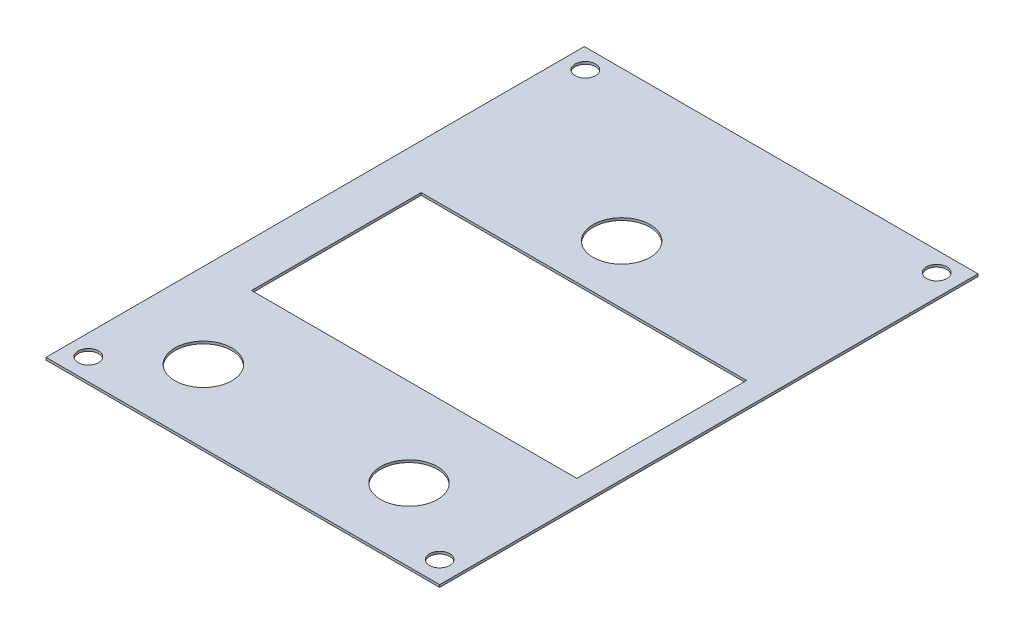
ISO-10303-21;
HEADER;
FILE_DESCRIPTION(('STEP AP214'),'2;1');
FILE_NAME('part.step','',(''),(''),'','','');
FILE_SCHEMA(('AUTOMOTIVE_DESIGN { 1 0 10303 214 1 1 1 1 }'));
ENDSEC;
DATA;
#1=APPLICATION_CONTEXT('core data for automotive mechanical design processes');
#2=APPLICATION_PROTOCOL_DEFINITION('international standard','automotive_design',2000,#1);
#3=PRODUCT_CONTEXT('',#1,'mechanical');
#4=PRODUCT('Part','Part','',(#3));
#5=PRODUCT_RELATED_PRODUCT_CATEGORY('part','',(#4));
#6=PRODUCT_DEFINITION_FORMATION('','',#4);
#7=PRODUCT_DEFINITION_CONTEXT('part definition',#1,'design');
#8=PRODUCT_DEFINITION('design','',#6,#7);
#9=PRODUCT_DEFINITION_SHAPE('','',#8);
#10=(LENGTH_UNIT() NAMED_UNIT(*) SI_UNIT(.MILLI.,.METRE.));
#11=(NAMED_UNIT(*) PLANE_ANGLE_UNIT() SI_UNIT($,.RADIAN.));
#12=(NAMED_UNIT(*) SI_UNIT($,.STERADIAN.) SOLID_ANGLE_UNIT());
#13=UNCERTAINTY_MEASURE_WITH_UNIT(LENGTH_MEASURE(1.E-05),#10,'distance_accuracy_value','');
#14=(GEOMETRIC_REPRESENTATION_CONTEXT(3) GLOBAL_UNCERTAINTY_ASSIGNED_CONTEXT((#13)) GLOBAL_UNIT_ASSIGNED_CONTEXT((#10,
#11,#12)) REPRESENTATION_CONTEXT('',''));
#15=CARTESIAN_POINT('',(0.,0.,0.));
#16=DIRECTION('',(0.,0.,1.));
#17=DIRECTION('',(1.,0.,0.));
#18=AXIS2_PLACEMENT_3D('',#15,#16,#17);
#19=CARTESIAN_POINT('',(0.,0.3,0.));
#20=DIRECTION('',(0.,1.,0.));
#21=DIRECTION('',(0.,0.,1.));
#22=AXIS2_PLACEMENT_3D('',#19,#20,#21);
#23=PLANE('',#22);
#24=CARTESIAN_POINT('',(33.146,0.3,-6.264));
#25=DIRECTION('',(0.,1.,0.));
#26=DIRECTION('',(0.,0.,1.));
#27=AXIS2_PLACEMENT_3D('',#24,#25,#26);
#28=CIRCLE('',#27,3.5);
#29=CARTESIAN_POINT('',(33.146,0.3,-2.764));
#30=VERTEX_POINT('',#29);
#31=EDGE_CURVE('E167',#30,#30,#28,.T.);
#32=ORIENTED_EDGE('',*,*,#31,.F.);
#33=EDGE_LOOP('',(#32));
#34=FACE_BOUND('',#33,.T.);
#35=CARTESIAN_POINT('',(0.,0.3,0.));
#36=DIRECTION('',(0.,1.,0.));
#37=DIRECTION('',(0.,0.,1.));
#38=AXIS2_PLACEMENT_3D('',#35,#36,#37);
#39=CIRCLE('',#38,1.25);
#40=CARTESIAN_POINT('',(0.,0.3,1.25));
#41=VERTEX_POINT('',#40);
#42=EDGE_CURVE('E183',#41,#41,#39,.T.);
#43=ORIENTED_EDGE('',*,*,#42,.F.);
#44=EDGE_LOOP('',(#43));
#45=FACE_BOUND('',#44,.T.);
#46=CARTESIAN_POINT('',(43.18,0.3,-61.087));
#47=DIRECTION('',(0.,1.,0.));
#48=DIRECTION('',(0.,0.,1.));
#49=AXIS2_PLACEMENT_3D('',#46,#47,#48);
#50=CIRCLE('',#49,1.25);
#51=CARTESIAN_POINT('',(43.18,0.3,-59.837));
#52=VERTEX_POINT('',#51);
#53=EDGE_CURVE('E199',#52,#52,#50,.T.);
#54=ORIENTED_EDGE('',*,*,#53,.F.);
#55=EDGE_LOOP('',(#54));
#56=FACE_BOUND('',#55,.T.);
#57=DIRECTION('',(0.,0.,1.));
#58=VECTOR('',#57,1.);
#59=CARTESIAN_POINT('',(-2.54,0.3,-63.5));
#60=LINE('',#59,#58);
#61=CARTESIAN_POINT('',(-2.54,0.3,-63.5));
#62=VERTEX_POINT('',#61);
#63=CARTESIAN_POINT('',(-2.53999999999999,0.3,2.667));
#64=VERTEX_POINT('',#63);
#65=EDGE_CURVE('E215',#62,#64,#60,.T.);
#66=ORIENTED_EDGE('',*,*,#65,.T.);
#67=DIRECTION('',(1.,0.,0.));
#68=VECTOR('',#67,1.);
#69=CARTESIAN_POINT('',(-2.53999999999999,0.3,2.667));
#70=LINE('',#69,#68);
#71=CARTESIAN_POINT('',(45.847,0.3,2.667));
#72=VERTEX_POINT('',#71);
#73=EDGE_CURVE('E219',#64,#72,#70,.T.);
#74=ORIENTED_EDGE('',*,*,#73,.T.);
#75=DIRECTION('',(0.,0.,-1.));
#76=VECTOR('',#75,1.);
#77=CARTESIAN_POINT('',(45.847,0.3,-63.5));
#78=LINE('',#77,#76);
#79=CARTESIAN_POINT('',(45.847,0.3,-63.5));
#80=VERTEX_POINT('',#79);
#81=EDGE_CURVE('E223',#72,#80,#78,.T.);
#82=ORIENTED_EDGE('',*,*,#81,.T.);
#83=DIRECTION('',(-1.,0.,0.));
#84=VECTOR('',#83,1.);
#85=CARTESIAN_POINT('',(-2.54,0.3,-63.5));
#86=LINE('',#85,#84);
#87=EDGE_CURVE('E226',#80,#62,#86,.T.);
#88=ORIENTED_EDGE('',*,*,#87,.T.);
#89=EDGE_LOOP('',(#66,#74,#82,#88));
#90=FACE_BOUND('',#89,.T.);
#91=CARTESIAN_POINT('',(0.,0.3,-61.087));
#92=DIRECTION('',(0.,1.,0.));
#93=DIRECTION('',(0.,0.,1.));
#94=AXIS2_PLACEMENT_3D('',#91,#92,#93);
#95=CIRCLE('',#94,1.25);
#96=CARTESIAN_POINT('',(0.,0.3,-59.837));
#97=VERTEX_POINT('',#96);
#98=EDGE_CURVE('E207',#97,#97,#95,.T.);
#99=ORIENTED_EDGE('',*,*,#98,.F.);
#100=EDGE_LOOP('',(#99));
#101=FACE_BOUND('',#100,.T.);
#102=CARTESIAN_POINT('',(43.18,0.3,0.));
#103=DIRECTION('',(0.,1.,0.));
#104=DIRECTION('',(0.,0.,1.));
#105=AXIS2_PLACEMENT_3D('',#102,#103,#104);
#106=CIRCLE('',#105,1.25);
#107=CARTESIAN_POINT('',(43.18,0.3,1.25));
#108=VERTEX_POINT('',#107);
#109=EDGE_CURVE('E191',#108,#108,#106,.T.);
#110=ORIENTED_EDGE('',*,*,#109,.F.);
#111=EDGE_LOOP('',(#110));
#112=FACE_BOUND('',#111,.T.);
#113=CARTESIAN_POINT('',(20.445,0.3,-45.103));
#114=DIRECTION('',(0.,1.,0.));
#115=DIRECTION('',(0.,0.,1.));
#116=AXIS2_PLACEMENT_3D('',#113,#114,#115);
#117=CIRCLE('',#116,3.5);
#118=CARTESIAN_POINT('',(20.445,0.3,-41.603));
#119=VERTEX_POINT('',#118);
#120=EDGE_CURVE('E175',#119,#119,#117,.T.);
#121=ORIENTED_EDGE('',*,*,#120,.F.);
#122=EDGE_LOOP('',(#121));
#123=FACE_BOUND('',#122,.T.);
#124=CARTESIAN_POINT('',(7.873,0.3,-6.264));
#125=DIRECTION('',(0.,1.,0.));
#126=DIRECTION('',(0.,0.,1.));
#127=AXIS2_PLACEMENT_3D('',#124,#125,#126);
#128=CIRCLE('',#127,3.5);
#129=CARTESIAN_POINT('',(7.873,0.3,-2.764));
#130=VERTEX_POINT('',#129);
#131=EDGE_CURVE('E159',#130,#130,#128,.T.);
#132=ORIENTED_EDGE('',*,*,#131,.F.);
#133=EDGE_LOOP('',(#132));
#134=FACE_BOUND('',#133,.T.);
#135=DIRECTION('',(1.,0.,0.));
#136=VECTOR('',#135,1.);
#137=CARTESIAN_POINT('',(2.973,0.3,-17.0735663614329));
#138=LINE('',#137,#136);
#139=CARTESIAN_POINT('',(2.973,0.3,-17.0735663614329));
#140=VERTEX_POINT('',#139);
#141=CARTESIAN_POINT('',(42.973,0.3,-17.0735663614329));
#142=VERTEX_POINT('',#141);
#143=EDGE_CURVE('E120',#140,#142,#138,.T.);
#144=ORIENTED_EDGE('',*,*,#143,.F.);
#145=DIRECTION('',(0.,0.,1.));
#146=VECTOR('',#145,1.);
#147=CARTESIAN_POINT('',(2.973,0.3,-37.933286915108));
#148=LINE('',#147,#146);
#149=CARTESIAN_POINT('',(2.973,0.3,-37.933286915108));
#150=VERTEX_POINT('',#149);
#151=EDGE_CURVE('E111',#150,#140,#148,.T.);
#152=ORIENTED_EDGE('',*,*,#151,.F.);
#153=DIRECTION('',(-1.,0.,0.));
#154=VECTOR('',#153,1.);
#155=CARTESIAN_POINT('',(2.973,0.3,-37.933286915108));
#156=LINE('',#155,#154);
#157=CARTESIAN_POINT('',(42.973,0.3,-37.933286915108));
#158=VERTEX_POINT('',#157);
#159=EDGE_CURVE('E137',#158,#150,#156,.T.);
#160=ORIENTED_EDGE('',*,*,#159,.F.);
#161=DIRECTION('',(0.,0.,-1.));
#162=VECTOR('',#161,1.);
#163=CARTESIAN_POINT('',(42.973,0.3,-37.933286915108));
#164=LINE('',#163,#162);
#165=EDGE_CURVE('E133',#142,#158,#164,.T.);
#166=ORIENTED_EDGE('',*,*,#165,.F.);
#167=EDGE_LOOP('',(#144,#152,#160,#166));
#168=FACE_BOUND('',#167,.T.);
#169=ADVANCED_FACE('F45',(#34,#45,#56,#90,#101,#112,#123,#134,#168),#23,.T.);
#170=CARTESIAN_POINT('',(0.,0.,0.));
#171=DIRECTION('',(0.,1.,0.));
#172=DIRECTION('',(0.,0.,1.));
#173=AXIS2_PLACEMENT_3D('',#170,#171,#172);
#174=PLANE('',#173);
#175=CARTESIAN_POINT('',(7.873,0.,-6.264));
#176=DIRECTION('',(0.,1.,0.));
#177=DIRECTION('',(0.,0.,1.));
#178=AXIS2_PLACEMENT_3D('',#175,#176,#177);
#179=CIRCLE('',#178,3.5);
#180=CARTESIAN_POINT('',(7.873,0.,-2.764));
#181=VERTEX_POINT('',#180);
#182=EDGE_CURVE('E129',#181,#181,#179,.T.);
#183=ORIENTED_EDGE('',*,*,#182,.T.);
#184=EDGE_LOOP('',(#183));
#185=FACE_BOUND('',#184,.T.);
#186=CARTESIAN_POINT('',(33.146,0.,-6.264));
#187=DIRECTION('',(0.,1.,0.));
#188=DIRECTION('',(0.,0.,1.));
#189=AXIS2_PLACEMENT_3D('',#186,#187,#188);
#190=CIRCLE('',#189,3.5);
#191=CARTESIAN_POINT('',(33.146,0.,-2.764));
#192=VERTEX_POINT('',#191);
#193=EDGE_CURVE('E163',#192,#192,#190,.T.);
#194=ORIENTED_EDGE('',*,*,#193,.T.);
#195=EDGE_LOOP('',(#194));
#196=FACE_BOUND('',#195,.T.);
#197=CARTESIAN_POINT('',(20.445,0.,-45.103));
#198=DIRECTION('',(0.,1.,0.));
#199=DIRECTION('',(0.,0.,1.));
#200=AXIS2_PLACEMENT_3D('',#197,#198,#199);
#201=CIRCLE('',#200,3.5);
#202=CARTESIAN_POINT('',(20.445,0.,-41.603));
#203=VERTEX_POINT('',#202);
#204=EDGE_CURVE('E171',#203,#203,#201,.T.);
#205=ORIENTED_EDGE('',*,*,#204,.T.);
#206=EDGE_LOOP('',(#205));
#207=FACE_BOUND('',#206,.T.);
#208=CARTESIAN_POINT('',(0.,0.,0.));
#209=DIRECTION('',(0.,1.,0.));
#210=DIRECTION('',(0.,0.,1.));
#211=AXIS2_PLACEMENT_3D('',#208,#209,#210);
#212=CIRCLE('',#211,1.25);
#213=CARTESIAN_POINT('',(0.,0.,1.25));
#214=VERTEX_POINT('',#213);
#215=EDGE_CURVE('E179',#214,#214,#212,.T.);
#216=ORIENTED_EDGE('',*,*,#215,.T.);
#217=EDGE_LOOP('',(#216));
#218=FACE_BOUND('',#217,.T.);
#219=CARTESIAN_POINT('',(43.18,0.,0.));
#220=DIRECTION('',(0.,1.,0.));
#221=DIRECTION('',(0.,0.,1.));
#222=AXIS2_PLACEMENT_3D('',#219,#220,#221);
#223=CIRCLE('',#222,1.25);
#224=CARTESIAN_POINT('',(43.18,0.,1.25));
#225=VERTEX_POINT('',#224);
#226=EDGE_CURVE('E187',#225,#225,#223,.T.);
#227=ORIENTED_EDGE('',*,*,#226,.T.);
#228=EDGE_LOOP('',(#227));
#229=FACE_BOUND('',#228,.T.);
#230=CARTESIAN_POINT('',(43.18,0.,-61.087));
#231=DIRECTION('',(0.,1.,0.));
#232=DIRECTION('',(0.,0.,1.));
#233=AXIS2_PLACEMENT_3D('',#230,#231,#232);
#234=CIRCLE('',#233,1.25);
#235=CARTESIAN_POINT('',(43.18,0.,-59.837));
#236=VERTEX_POINT('',#235);
#237=EDGE_CURVE('E195',#236,#236,#234,.T.);
#238=ORIENTED_EDGE('',*,*,#237,.T.);
#239=EDGE_LOOP('',(#238));
#240=FACE_BOUND('',#239,.T.);
#241=CARTESIAN_POINT('',(0.,0.,-61.087));
#242=DIRECTION('',(0.,1.,0.));
#243=DIRECTION('',(0.,0.,1.));
#244=AXIS2_PLACEMENT_3D('',#241,#242,#243);
#245=CIRCLE('',#244,1.25);
#246=CARTESIAN_POINT('',(0.,0.,-59.837));
#247=VERTEX_POINT('',#246);
#248=EDGE_CURVE('E203',#247,#247,#245,.T.);
#249=ORIENTED_EDGE('',*,*,#248,.T.);
#250=EDGE_LOOP('',(#249));
#251=FACE_BOUND('',#250,.T.);
#252=DIRECTION('',(0.,0.,1.));
#253=VECTOR('',#252,1.);
#254=CARTESIAN_POINT('',(-2.54,0.,-63.5));
#255=LINE('',#254,#253);
#256=CARTESIAN_POINT('',(-2.54,0.,-63.5));
#257=VERTEX_POINT('',#256);
#258=CARTESIAN_POINT('',(-2.53999999999999,0.,2.667));
#259=VERTEX_POINT('',#258);
#260=EDGE_CURVE('E211',#257,#259,#255,.T.);
#261=ORIENTED_EDGE('',*,*,#260,.F.);
#262=DIRECTION('',(-1.,0.,0.));
#263=VECTOR('',#262,1.);
#264=CARTESIAN_POINT('',(-2.54,0.,-63.5));
#265=LINE('',#264,#263);
#266=CARTESIAN_POINT('',(45.847,0.,-63.5));
#267=VERTEX_POINT('',#266);
#268=EDGE_CURVE('E220',#267,#257,#265,.T.);
#269=ORIENTED_EDGE('',*,*,#268,.F.);
#270=DIRECTION('',(0.,0.,-1.));
#271=VECTOR('',#270,1.);
#272=CARTESIAN_POINT('',(45.847,0.,-63.5));
#273=LINE('',#272,#271);
#274=CARTESIAN_POINT('',(45.847,0.,2.667));
#275=VERTEX_POINT('',#274);
#276=EDGE_CURVE('E236',#275,#267,#273,.T.);
#277=ORIENTED_EDGE('',*,*,#276,.F.);
#278=DIRECTION('',(1.,0.,0.));
#279=VECTOR('',#278,1.);
#280=CARTESIAN_POINT('',(-2.53999999999999,0.,2.667));
#281=LINE('',#280,#279);
#282=EDGE_CURVE('E233',#259,#275,#281,.T.);
#283=ORIENTED_EDGE('',*,*,#282,.F.);
#284=EDGE_LOOP('',(#261,#269,#277,#283));
#285=FACE_BOUND('',#284,.T.);
#286=DIRECTION('',(0.,0.,1.));
#287=VECTOR('',#286,1.);
#288=CARTESIAN_POINT('',(2.973,0.,-37.933286915108));
#289=LINE('',#288,#287);
#290=CARTESIAN_POINT('',(2.973,0.,-37.933286915108));
#291=VERTEX_POINT('',#290);
#292=CARTESIAN_POINT('',(2.973,0.,-17.0735663614329));
#293=VERTEX_POINT('',#292);
#294=EDGE_CURVE('E69',#291,#293,#289,.T.);
#295=ORIENTED_EDGE('',*,*,#294,.T.);
#296=DIRECTION('',(1.,0.,0.));
#297=VECTOR('',#296,1.);
#298=CARTESIAN_POINT('',(2.973,0.,-17.0735663614329));
#299=LINE('',#298,#297);
#300=CARTESIAN_POINT('',(42.973,0.,-17.0735663614329));
#301=VERTEX_POINT('',#300);
#302=EDGE_CURVE('E127',#293,#301,#299,.T.);
#303=ORIENTED_EDGE('',*,*,#302,.T.);
#304=DIRECTION('',(0.,0.,-1.));
#305=VECTOR('',#304,1.);
#306=CARTESIAN_POINT('',(42.973,0.,-37.933286915108));
#307=LINE('',#306,#305);
#308=CARTESIAN_POINT('',(42.973,0.,-37.933286915108));
#309=VERTEX_POINT('',#308);
#310=EDGE_CURVE('E146',#301,#309,#307,.T.);
#311=ORIENTED_EDGE('',*,*,#310,.T.);
#312=DIRECTION('',(-1.,0.,0.));
#313=VECTOR('',#312,1.);
#314=CARTESIAN_POINT('',(2.973,0.,-37.933286915108));
#315=LINE('',#314,#313);
#316=EDGE_CURVE('E121',#309,#291,#315,.T.);
#317=ORIENTED_EDGE('',*,*,#316,.T.);
#318=EDGE_LOOP('',(#295,#303,#311,#317));
#319=FACE_BOUND('',#318,.T.);
#320=ADVANCED_FACE('F259',(#185,#196,#207,#218,#229,#240,#251,#285,#319),#174,.F.);
#321=CARTESIAN_POINT('',(-2.54,0.3,-63.5));
#322=DIRECTION('',(1.,0.,0.));
#323=DIRECTION('',(0.,0.,-1.));
#324=AXIS2_PLACEMENT_3D('',#321,#322,#323);
#325=PLANE('',#324);
#326=ORIENTED_EDGE('',*,*,#260,.T.);
#327=DIRECTION('',(0.,-1.,0.));
#328=VECTOR('',#327,1.);
#329=CARTESIAN_POINT('',(-2.53999999999999,0.3,2.667));
#330=LINE('',#329,#328);
#331=EDGE_CURVE('E11',#64,#259,#330,.T.);
#332=ORIENTED_EDGE('',*,*,#331,.F.);
#333=ORIENTED_EDGE('',*,*,#65,.F.);
#334=DIRECTION('',(0.,-1.,0.));
#335=VECTOR('',#334,1.);
#336=CARTESIAN_POINT('',(-2.54,0.3,-63.5));
#337=LINE('',#336,#335);
#338=EDGE_CURVE('E229',#62,#257,#337,.T.);
#339=ORIENTED_EDGE('',*,*,#338,.T.);
#340=EDGE_LOOP('',(#326,#332,#333,#339));
#341=FACE_BOUND('',#340,.T.);
#342=ADVANCED_FACE('F47',(#341),#325,.F.);
#343=CARTESIAN_POINT('',(-2.53999999999999,0.3,2.667));
#344=DIRECTION('',(0.,0.,-1.));
#345=DIRECTION('',(-1.,0.,0.));
#346=AXIS2_PLACEMENT_3D('',#343,#344,#345);
#347=PLANE('',#346);
#348=ORIENTED_EDGE('',*,*,#282,.T.);
#349=DIRECTION('',(0.,-1.,0.));
#350=VECTOR('',#349,1.);
#351=CARTESIAN_POINT('',(45.847,0.3,2.667));
#352=LINE('',#351,#350);
#353=EDGE_CURVE('E54',#72,#275,#352,.T.);
#354=ORIENTED_EDGE('',*,*,#353,.F.);
#355=ORIENTED_EDGE('',*,*,#73,.F.);
#356=ORIENTED_EDGE('',*,*,#331,.T.);
#357=EDGE_LOOP('',(#348,#354,#355,#356));
#358=FACE_BOUND('',#357,.T.);
#359=ADVANCED_FACE('F270',(#358),#347,.F.);
#360=CARTESIAN_POINT('',(45.847,0.3,-63.5));
#361=DIRECTION('',(-1.,0.,0.));
#362=DIRECTION('',(0.,0.,1.));
#363=AXIS2_PLACEMENT_3D('',#360,#361,#362);
#364=PLANE('',#363);
#365=ORIENTED_EDGE('',*,*,#276,.T.);
#366=DIRECTION('',(0.,-1.,0.));
#367=VECTOR('',#366,1.);
#368=CARTESIAN_POINT('',(45.847,0.3,-63.5));
#369=LINE('',#368,#367);
#370=EDGE_CURVE('E244',#80,#267,#369,.T.);
#371=ORIENTED_EDGE('',*,*,#370,.F.);
#372=ORIENTED_EDGE('',*,*,#81,.F.);
#373=ORIENTED_EDGE('',*,*,#353,.T.);
#374=EDGE_LOOP('',(#365,#371,#372,#373));
#375=FACE_BOUND('',#374,.T.);
#376=ADVANCED_FACE('F253',(#375),#364,.F.);
#377=CARTESIAN_POINT('',(-2.54,0.3,-63.5));
#378=DIRECTION('',(0.,0.,1.));
#379=DIRECTION('',(1.,0.,0.));
#380=AXIS2_PLACEMENT_3D('',#377,#378,#379);
#381=PLANE('',#380);
#382=ORIENTED_EDGE('',*,*,#268,.T.);
#383=ORIENTED_EDGE('',*,*,#338,.F.);
#384=ORIENTED_EDGE('',*,*,#87,.F.);
#385=ORIENTED_EDGE('',*,*,#370,.T.);
#386=EDGE_LOOP('',(#382,#383,#384,#385));
#387=FACE_BOUND('',#386,.T.);
#388=ADVANCED_FACE('F263',(#387),#381,.F.);
#389=CARTESIAN_POINT('',(0.,0.3,-61.087));
#390=DIRECTION('',(0.,-1.,0.));
#391=DIRECTION('',(0.,0.,-1.));
#392=AXIS2_PLACEMENT_3D('',#389,#390,#391);
#393=CYLINDRICAL_SURFACE('',#392,1.25);
#394=ORIENTED_EDGE('',*,*,#98,.T.);
#395=EDGE_LOOP('',(#394));
#396=FACE_BOUND('',#395,.T.);
#397=ORIENTED_EDGE('',*,*,#248,.F.);
#398=EDGE_LOOP('',(#397));
#399=FACE_BOUND('',#398,.T.);
#400=ADVANCED_FACE('F288',(#396,#399),#393,.F.);
#401=CARTESIAN_POINT('',(43.18,0.3,-61.087));
#402=DIRECTION('',(0.,-1.,0.));
#403=DIRECTION('',(0.,0.,-1.));
#404=AXIS2_PLACEMENT_3D('',#401,#402,#403);
#405=CYLINDRICAL_SURFACE('',#404,1.25);
#406=ORIENTED_EDGE('',*,*,#53,.T.);
#407=EDGE_LOOP('',(#406));
#408=FACE_BOUND('',#407,.T.);
#409=ORIENTED_EDGE('',*,*,#237,.F.);
#410=EDGE_LOOP('',(#409));
#411=FACE_BOUND('',#410,.T.);
#412=ADVANCED_FACE('F295',(#408,#411),#405,.F.);
#413=CARTESIAN_POINT('',(43.18,0.3,0.));
#414=DIRECTION('',(0.,-1.,0.));
#415=DIRECTION('',(0.,0.,-1.));
#416=AXIS2_PLACEMENT_3D('',#413,#414,#415);
#417=CYLINDRICAL_SURFACE('',#416,1.25);
#418=ORIENTED_EDGE('',*,*,#109,.T.);
#419=EDGE_LOOP('',(#418));
#420=FACE_BOUND('',#419,.T.);
#421=ORIENTED_EDGE('',*,*,#226,.F.);
#422=EDGE_LOOP('',(#421));
#423=FACE_BOUND('',#422,.T.);
#424=ADVANCED_FACE('F300',(#420,#423),#417,.F.);
#425=CARTESIAN_POINT('',(0.,0.3,0.));
#426=DIRECTION('',(0.,-1.,0.));
#427=DIRECTION('',(0.,0.,-1.));
#428=AXIS2_PLACEMENT_3D('',#425,#426,#427);
#429=CYLINDRICAL_SURFACE('',#428,1.25);
#430=ORIENTED_EDGE('',*,*,#42,.T.);
#431=EDGE_LOOP('',(#430));
#432=FACE_BOUND('',#431,.T.);
#433=ORIENTED_EDGE('',*,*,#215,.F.);
#434=EDGE_LOOP('',(#433));
#435=FACE_BOUND('',#434,.T.);
#436=ADVANCED_FACE('F332',(#432,#435),#429,.F.);
#437=CARTESIAN_POINT('',(20.445,0.3,-45.103));
#438=DIRECTION('',(0.,-1.,0.));
#439=DIRECTION('',(0.,0.,-1.));
#440=AXIS2_PLACEMENT_3D('',#437,#438,#439);
#441=CYLINDRICAL_SURFACE('',#440,3.5);
#442=ORIENTED_EDGE('',*,*,#120,.T.);
#443=EDGE_LOOP('',(#442));
#444=FACE_BOUND('',#443,.T.);
#445=ORIENTED_EDGE('',*,*,#204,.F.);
#446=EDGE_LOOP('',(#445));
#447=FACE_BOUND('',#446,.T.);
#448=ADVANCED_FACE('F338',(#444,#447),#441,.F.);
#449=CARTESIAN_POINT('',(33.146,0.3,-6.264));
#450=DIRECTION('',(0.,-1.,0.));
#451=DIRECTION('',(0.,0.,-1.));
#452=AXIS2_PLACEMENT_3D('',#449,#450,#451);
#453=CYLINDRICAL_SURFACE('',#452,3.5);
#454=ORIENTED_EDGE('',*,*,#31,.T.);
#455=EDGE_LOOP('',(#454));
#456=FACE_BOUND('',#455,.T.);
#457=ORIENTED_EDGE('',*,*,#193,.F.);
#458=EDGE_LOOP('',(#457));
#459=FACE_BOUND('',#458,.T.);
#460=ADVANCED_FACE('F316',(#456,#459),#453,.F.);
#461=CARTESIAN_POINT('',(7.873,0.3,-6.264));
#462=DIRECTION('',(0.,-1.,0.));
#463=DIRECTION('',(0.,0.,-1.));
#464=AXIS2_PLACEMENT_3D('',#461,#462,#463);
#465=CYLINDRICAL_SURFACE('',#464,3.5);
#466=ORIENTED_EDGE('',*,*,#131,.T.);
#467=EDGE_LOOP('',(#466));
#468=FACE_BOUND('',#467,.T.);
#469=ORIENTED_EDGE('',*,*,#182,.F.);
#470=EDGE_LOOP('',(#469));
#471=FACE_BOUND('',#470,.T.);
#472=ADVANCED_FACE('F313',(#468,#471),#465,.F.);
#473=CARTESIAN_POINT('',(2.973,0.3,-37.933286915108));
#474=DIRECTION('',(1.,0.,0.));
#475=DIRECTION('',(0.,0.,-1.));
#476=AXIS2_PLACEMENT_3D('',#473,#474,#475);
#477=PLANE('',#476);
#478=ORIENTED_EDGE('',*,*,#294,.F.);
#479=DIRECTION('',(0.,-1.,0.));
#480=VECTOR('',#479,1.);
#481=CARTESIAN_POINT('',(2.973,0.3,-37.933286915108));
#482=LINE('',#481,#480);
#483=EDGE_CURVE('E115',#150,#291,#482,.T.);
#484=ORIENTED_EDGE('',*,*,#483,.F.);
#485=ORIENTED_EDGE('',*,*,#151,.T.);
#486=DIRECTION('',(0.,-1.,0.));
#487=VECTOR('',#486,1.);
#488=CARTESIAN_POINT('',(2.973,0.3,-17.0735663614329));
#489=LINE('',#488,#487);
#490=EDGE_CURVE('E114',#140,#293,#489,.T.);
#491=ORIENTED_EDGE('',*,*,#490,.T.);
#492=EDGE_LOOP('',(#478,#484,#485,#491));
#493=FACE_BOUND('',#492,.T.);
#494=ADVANCED_FACE('F113',(#493),#477,.T.);
#495=CARTESIAN_POINT('',(2.973,0.3,-17.0735663614329));
#496=DIRECTION('',(0.,0.,-1.));
#497=DIRECTION('',(-1.,0.,0.));
#498=AXIS2_PLACEMENT_3D('',#495,#496,#497);
#499=PLANE('',#498);
#500=ORIENTED_EDGE('',*,*,#302,.F.);
#501=ORIENTED_EDGE('',*,*,#490,.F.);
#502=ORIENTED_EDGE('',*,*,#143,.T.);
#503=DIRECTION('',(0.,-1.,0.));
#504=VECTOR('',#503,1.);
#505=CARTESIAN_POINT('',(42.973,0.3,-17.0735663614329));
#506=LINE('',#505,#504);
#507=EDGE_CURVE('E130',#142,#301,#506,.T.);
#508=ORIENTED_EDGE('',*,*,#507,.T.);
#509=EDGE_LOOP('',(#500,#501,#502,#508));
#510=FACE_BOUND('',#509,.T.);
#511=ADVANCED_FACE('F124',(#510),#499,.T.);
#512=CARTESIAN_POINT('',(42.973,0.3,-37.933286915108));
#513=DIRECTION('',(-1.,0.,0.));
#514=DIRECTION('',(0.,0.,1.));
#515=AXIS2_PLACEMENT_3D('',#512,#513,#514);
#516=PLANE('',#515);
#517=ORIENTED_EDGE('',*,*,#310,.F.);
#518=ORIENTED_EDGE('',*,*,#507,.F.);
#519=ORIENTED_EDGE('',*,*,#165,.T.);
#520=DIRECTION('',(0.,-1.,0.));
#521=VECTOR('',#520,1.);
#522=CARTESIAN_POINT('',(42.973,0.3,-37.933286915108));
#523=LINE('',#522,#521);
#524=EDGE_CURVE('E61',#158,#309,#523,.T.);
#525=ORIENTED_EDGE('',*,*,#524,.T.);
#526=EDGE_LOOP('',(#517,#518,#519,#525));
#527=FACE_BOUND('',#526,.T.);
#528=ADVANCED_FACE('F352',(#527),#516,.T.);
#529=CARTESIAN_POINT('',(2.973,0.3,-37.933286915108));
#530=DIRECTION('',(0.,0.,1.));
#531=DIRECTION('',(1.,0.,0.));
#532=AXIS2_PLACEMENT_3D('',#529,#530,#531);
#533=PLANE('',#532);
#534=ORIENTED_EDGE('',*,*,#316,.F.);
#535=ORIENTED_EDGE('',*,*,#524,.F.);
#536=ORIENTED_EDGE('',*,*,#159,.T.);
#537=ORIENTED_EDGE('',*,*,#483,.T.);
#538=EDGE_LOOP('',(#534,#535,#536,#537));
#539=FACE_BOUND('',#538,.T.);
#540=ADVANCED_FACE('F355',(#539),#533,.T.);
#541=CLOSED_SHELL('',(#169,#320,#342,#359,#376,#388,#400,#412,#424,#436,#448,#460,#472,#494,
#511,#528,#540));
#542=MANIFOLD_SOLID_BREP('B2',#541);
#543=ADVANCED_BREP_SHAPE_REPRESENTATION('',(#18,#542),#14);
#544=SHAPE_DEFINITION_REPRESENTATION(#9,#543);
ENDSEC;
END-ISO-10303-21;
